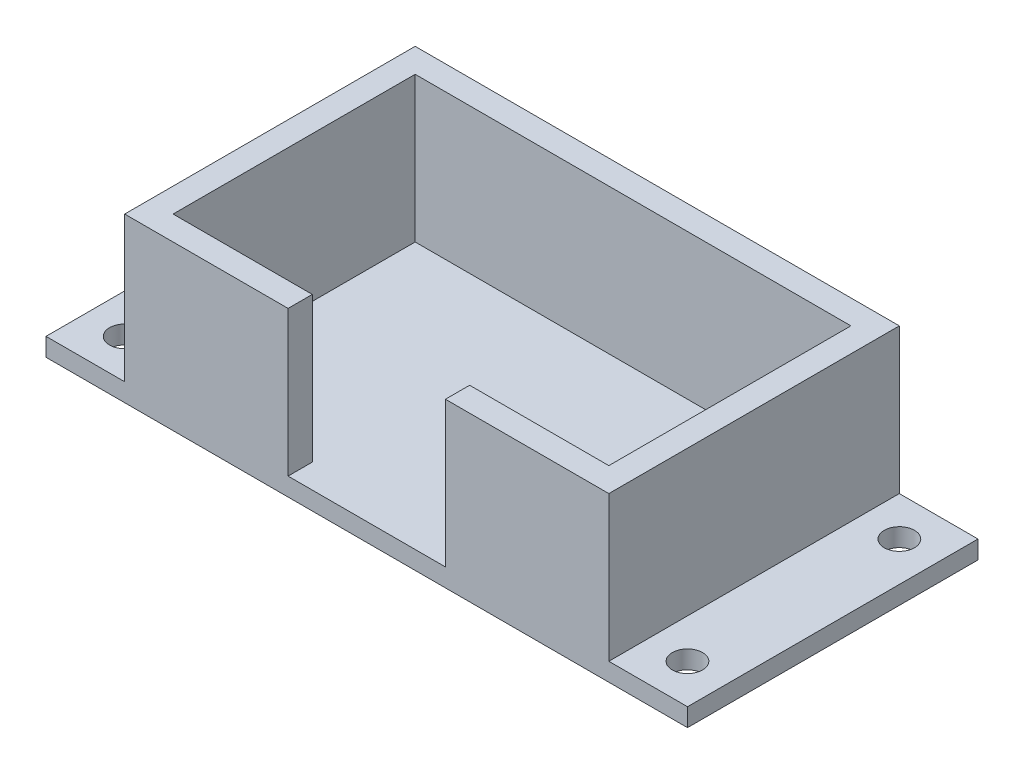
ISO-10303-21;
HEADER;
FILE_DESCRIPTION(('STEP AP214'),'2;1');
FILE_NAME('part.step','',(''),(''),'','','');
FILE_SCHEMA(('AUTOMOTIVE_DESIGN { 1 0 10303 214 1 1 1 1 }'));
ENDSEC;
DATA;
#1=APPLICATION_CONTEXT('core data for automotive mechanical design processes');
#2=APPLICATION_PROTOCOL_DEFINITION('international standard','automotive_design',2000,#1);
#3=PRODUCT_CONTEXT('',#1,'mechanical');
#4=PRODUCT('Part','Part','',(#3));
#5=PRODUCT_RELATED_PRODUCT_CATEGORY('part','',(#4));
#6=PRODUCT_DEFINITION_FORMATION('','',#4);
#7=PRODUCT_DEFINITION_CONTEXT('part definition',#1,'design');
#8=PRODUCT_DEFINITION('design','',#6,#7);
#9=PRODUCT_DEFINITION_SHAPE('','',#8);
#10=(LENGTH_UNIT() NAMED_UNIT(*) SI_UNIT(.MILLI.,.METRE.));
#11=(NAMED_UNIT(*) PLANE_ANGLE_UNIT() SI_UNIT($,.RADIAN.));
#12=(NAMED_UNIT(*) SI_UNIT($,.STERADIAN.) SOLID_ANGLE_UNIT());
#13=UNCERTAINTY_MEASURE_WITH_UNIT(LENGTH_MEASURE(1.E-05),#10,'distance_accuracy_value','');
#14=(GEOMETRIC_REPRESENTATION_CONTEXT(3) GLOBAL_UNCERTAINTY_ASSIGNED_CONTEXT((#13)) GLOBAL_UNIT_ASSIGNED_CONTEXT((#10,
#11,#12)) REPRESENTATION_CONTEXT('',''));
#15=CARTESIAN_POINT('',(0.,0.,0.));
#16=DIRECTION('',(0.,0.,1.));
#17=DIRECTION('',(1.,0.,0.));
#18=AXIS2_PLACEMENT_3D('',#15,#16,#17);
#19=CARTESIAN_POINT('',(0.,3.,0.));
#20=DIRECTION('',(0.,1.,0.));
#21=DIRECTION('',(0.,0.,1.));
#22=AXIS2_PLACEMENT_3D('',#19,#20,#21);
#23=PLANE('',#22);
#24=DIRECTION('',(0.,0.,1.));
#25=VECTOR('',#24,1.);
#26=CARTESIAN_POINT('',(-48.1932702603594,3.,11.4867913458012));
#27=LINE('',#26,#25);
#28=CARTESIAN_POINT('',(-48.1932702603594,3.,-36.5132086541988));
#29=VERTEX_POINT('',#28);
#30=CARTESIAN_POINT('',(-48.1932702603594,3.,11.4867913458012));
#31=VERTEX_POINT('',#30);
#32=EDGE_CURVE('E297',#29,#31,#27,.T.);
#33=ORIENTED_EDGE('',*,*,#32,.F.);
#34=DIRECTION('',(-1.,0.,0.));
#35=VECTOR('',#34,1.);
#36=CARTESIAN_POINT('',(44.8067297396406,3.,-36.5132086541988));
#37=LINE('',#36,#35);
#38=CARTESIAN_POINT('',(-61.1932702603594,3.,-36.5132086541988));
#39=VERTEX_POINT('',#38);
#40=EDGE_CURVE('E227',#29,#39,#37,.T.);
#41=ORIENTED_EDGE('',*,*,#40,.T.);
#42=DIRECTION('',(0.,0.,1.));
#43=VECTOR('',#42,1.);
#44=CARTESIAN_POINT('',(-61.1932702603594,3.,-36.5132086541988));
#45=LINE('',#44,#43);
#46=CARTESIAN_POINT('',(-61.1932702603594,3.,11.4867913458012));
#47=VERTEX_POINT('',#46);
#48=EDGE_CURVE('E226',#39,#47,#45,.T.);
#49=ORIENTED_EDGE('',*,*,#48,.T.);
#50=DIRECTION('',(1.,0.,0.));
#51=VECTOR('',#50,1.);
#52=CARTESIAN_POINT('',(-61.1932702603594,3.,11.4867913458012));
#53=LINE('',#52,#51);
#54=EDGE_CURVE('E231',#47,#31,#53,.T.);
#55=ORIENTED_EDGE('',*,*,#54,.T.);
#56=EDGE_LOOP('',(#33,#41,#49,#55));
#57=FACE_BOUND('',#56,.T.);
#58=CARTESIAN_POINT('',(-54.6901715011559,3.,4.98679134580125));
#59=DIRECTION('',(0.,1.,0.));
#60=DIRECTION('',(0.,0.,1.));
#61=AXIS2_PLACEMENT_3D('',#58,#59,#60);
#62=CIRCLE('',#61,2.5);
#63=CARTESIAN_POINT('',(-54.6901715011559,3.,7.48679134580125));
#64=VERTEX_POINT('',#63);
#65=EDGE_CURVE('E207',#64,#64,#62,.T.);
#66=ORIENTED_EDGE('',*,*,#65,.F.);
#67=EDGE_LOOP('',(#66));
#68=FACE_BOUND('',#67,.T.);
#69=CARTESIAN_POINT('',(-54.7235519989521,3.,-30.0132086541988));
#70=DIRECTION('',(0.,1.,0.));
#71=DIRECTION('',(0.,0.,1.));
#72=AXIS2_PLACEMENT_3D('',#69,#70,#71);
#73=CIRCLE('',#72,2.5);
#74=CARTESIAN_POINT('',(-54.7235519989521,3.,-27.5132086541988));
#75=VERTEX_POINT('',#74);
#76=EDGE_CURVE('E215',#75,#75,#73,.T.);
#77=ORIENTED_EDGE('',*,*,#76,.F.);
#78=EDGE_LOOP('',(#77));
#79=FACE_BOUND('',#78,.T.);
#80=ADVANCED_FACE('F45',(#57,#68,#79),#23,.T.);
#81=DIRECTION('',(0.,0.,-1.));
#82=VECTOR('',#81,1.);
#83=CARTESIAN_POINT('',(31.8067297396406,3.,-36.5132086541988));
#84=LINE('',#83,#82);
#85=CARTESIAN_POINT('',(31.8067297396406,3.,11.4867913458012));
#86=VERTEX_POINT('',#85);
#87=CARTESIAN_POINT('',(31.8067297396406,3.,-36.5132086541988));
#88=VERTEX_POINT('',#87);
#89=EDGE_CURVE('E288',#86,#88,#84,.T.);
#90=ORIENTED_EDGE('',*,*,#89,.F.);
#91=CARTESIAN_POINT('',(44.8067297396406,3.,11.4867913458012));
#92=VERTEX_POINT('',#91);
#93=EDGE_CURVE('E230',#86,#92,#53,.T.);
#94=ORIENTED_EDGE('',*,*,#93,.T.);
#95=DIRECTION('',(0.,0.,-1.));
#96=VECTOR('',#95,1.);
#97=CARTESIAN_POINT('',(44.8067297396406,3.,11.4867913458012));
#98=LINE('',#97,#96);
#99=CARTESIAN_POINT('',(44.8067297396406,3.,-36.5132086541988));
#100=VERTEX_POINT('',#99);
#101=EDGE_CURVE('E234',#92,#100,#98,.T.);
#102=ORIENTED_EDGE('',*,*,#101,.T.);
#103=EDGE_CURVE('E223',#100,#88,#37,.T.);
#104=ORIENTED_EDGE('',*,*,#103,.T.);
#105=EDGE_LOOP('',(#90,#94,#102,#104));
#106=FACE_BOUND('',#105,.T.);
#107=CARTESIAN_POINT('',(38.315604170315,3.,-30.0132086541988));
#108=DIRECTION('',(0.,1.,0.));
#109=DIRECTION('',(0.,0.,1.));
#110=AXIS2_PLACEMENT_3D('',#107,#108,#109);
#111=CIRCLE('',#110,2.5);
#112=CARTESIAN_POINT('',(38.315604170315,3.,-27.5132086541988));
#113=VERTEX_POINT('',#112);
#114=EDGE_CURVE('E199',#113,#113,#111,.T.);
#115=ORIENTED_EDGE('',*,*,#114,.F.);
#116=EDGE_LOOP('',(#115));
#117=FACE_BOUND('',#116,.T.);
#118=CARTESIAN_POINT('',(38.2979468074763,3.,4.98679134580125));
#119=DIRECTION('',(0.,1.,0.));
#120=DIRECTION('',(0.,0.,1.));
#121=AXIS2_PLACEMENT_3D('',#118,#119,#120);
#122=CIRCLE('',#121,2.5);
#123=CARTESIAN_POINT('',(38.2979468074763,3.,7.48679134580125));
#124=VERTEX_POINT('',#123);
#125=EDGE_CURVE('E189',#124,#124,#122,.T.);
#126=ORIENTED_EDGE('',*,*,#125,.F.);
#127=EDGE_LOOP('',(#126));
#128=FACE_BOUND('',#127,.T.);
#129=ADVANCED_FACE('F286',(#106,#117,#128),#23,.T.);
#130=DIRECTION('',(0.,0.,-1.));
#131=VECTOR('',#130,1.);
#132=CARTESIAN_POINT('',(-21.1932702603594,3.,11.4867913458012));
#133=LINE('',#132,#131);
#134=CARTESIAN_POINT('',(-21.1932702603594,3.,11.4867913458012));
#135=VERTEX_POINT('',#134);
#136=CARTESIAN_POINT('',(-21.1932702603594,3.,7.48679134580125));
#137=VERTEX_POINT('',#136);
#138=EDGE_CURVE('E180',#135,#137,#133,.T.);
#139=ORIENTED_EDGE('',*,*,#138,.F.);
#140=CARTESIAN_POINT('',(4.80672973964064,3.,11.4867913458012));
#141=VERTEX_POINT('',#140);
#142=EDGE_CURVE('E235',#135,#141,#53,.T.);
#143=ORIENTED_EDGE('',*,*,#142,.T.);
#144=DIRECTION('',(0.,0.,1.));
#145=VECTOR('',#144,1.);
#146=CARTESIAN_POINT('',(4.80672973964063,3.,7.48679134580125));
#147=LINE('',#146,#145);
#148=CARTESIAN_POINT('',(4.80672973964063,3.,7.48679134580125));
#149=VERTEX_POINT('',#148);
#150=EDGE_CURVE('E68',#149,#141,#147,.T.);
#151=ORIENTED_EDGE('',*,*,#150,.F.);
#152=DIRECTION('',(-1.,0.,0.));
#153=VECTOR('',#152,1.);
#154=CARTESIAN_POINT('',(27.8067297396406,3.,7.48679134580125));
#155=LINE('',#154,#153);
#156=CARTESIAN_POINT('',(27.8067297396406,3.,7.48679134580125));
#157=VERTEX_POINT('',#156);
#158=EDGE_CURVE('E303',#157,#149,#155,.T.);
#159=ORIENTED_EDGE('',*,*,#158,.F.);
#160=DIRECTION('',(0.,0.,1.));
#161=VECTOR('',#160,1.);
#162=CARTESIAN_POINT('',(27.8067297396406,3.,-32.5132086541987));
#163=LINE('',#162,#161);
#164=CARTESIAN_POINT('',(27.8067297396406,3.,-32.5132086541987));
#165=VERTEX_POINT('',#164);
#166=EDGE_CURVE('E346',#165,#157,#163,.T.);
#167=ORIENTED_EDGE('',*,*,#166,.F.);
#168=DIRECTION('',(1.,0.,0.));
#169=VECTOR('',#168,1.);
#170=CARTESIAN_POINT('',(-44.1932702603594,3.,-32.5132086541987));
#171=LINE('',#170,#169);
#172=CARTESIAN_POINT('',(-44.1932702603594,3.,-32.5132086541987));
#173=VERTEX_POINT('',#172);
#174=EDGE_CURVE('E351',#173,#165,#171,.T.);
#175=ORIENTED_EDGE('',*,*,#174,.F.);
#176=DIRECTION('',(0.,0.,-1.));
#177=VECTOR('',#176,1.);
#178=CARTESIAN_POINT('',(-44.1932702603594,3.,-32.5132086541987));
#179=LINE('',#178,#177);
#180=CARTESIAN_POINT('',(-44.1932702603594,3.,7.48679134580125));
#181=VERTEX_POINT('',#180);
#182=EDGE_CURVE('E353',#181,#173,#179,.T.);
#183=ORIENTED_EDGE('',*,*,#182,.F.);
#184=DIRECTION('',(-1.,0.,0.));
#185=VECTOR('',#184,1.);
#186=CARTESIAN_POINT('',(-44.1932702603594,3.,7.48679134580125));
#187=LINE('',#186,#185);
#188=EDGE_CURVE('E61',#137,#181,#187,.T.);
#189=ORIENTED_EDGE('',*,*,#188,.F.);
#190=EDGE_LOOP('',(#139,#143,#151,#159,#167,#175,#183,#189));
#191=FACE_BOUND('',#190,.T.);
#192=ADVANCED_FACE('F402',(#191),#23,.T.);
#193=CARTESIAN_POINT('',(0.,0.,0.));
#194=DIRECTION('',(0.,1.,0.));
#195=DIRECTION('',(0.,0.,1.));
#196=AXIS2_PLACEMENT_3D('',#193,#194,#195);
#197=PLANE('',#196);
#198=DIRECTION('',(-1.,0.,0.));
#199=VECTOR('',#198,1.);
#200=CARTESIAN_POINT('',(44.8067297396406,0.,-36.5132086541988));
#201=LINE('',#200,#199);
#202=CARTESIAN_POINT('',(44.8067297396406,0.,-36.5132086541988));
#203=VERTEX_POINT('',#202);
#204=CARTESIAN_POINT('',(-61.1932702603594,0.,-36.5132086541988));
#205=VERTEX_POINT('',#204);
#206=EDGE_CURVE('E219',#203,#205,#201,.T.);
#207=ORIENTED_EDGE('',*,*,#206,.F.);
#208=DIRECTION('',(0.,0.,-1.));
#209=VECTOR('',#208,1.);
#210=CARTESIAN_POINT('',(44.8067297396406,0.,11.4867913458012));
#211=LINE('',#210,#209);
#212=CARTESIAN_POINT('',(44.8067297396406,0.,11.4867913458012));
#213=VERTEX_POINT('',#212);
#214=EDGE_CURVE('E248',#213,#203,#211,.T.);
#215=ORIENTED_EDGE('',*,*,#214,.F.);
#216=DIRECTION('',(1.,0.,0.));
#217=VECTOR('',#216,1.);
#218=CARTESIAN_POINT('',(-61.1932702603594,0.,11.4867913458012));
#219=LINE('',#218,#217);
#220=CARTESIAN_POINT('',(-61.1932702603594,0.,11.4867913458012));
#221=VERTEX_POINT('',#220);
#222=EDGE_CURVE('E245',#221,#213,#219,.T.);
#223=ORIENTED_EDGE('',*,*,#222,.F.);
#224=DIRECTION('',(0.,0.,1.));
#225=VECTOR('',#224,1.);
#226=CARTESIAN_POINT('',(-61.1932702603594,0.,-36.5132086541988));
#227=LINE('',#226,#225);
#228=EDGE_CURVE('E242',#205,#221,#227,.T.);
#229=ORIENTED_EDGE('',*,*,#228,.F.);
#230=EDGE_LOOP('',(#207,#215,#223,#229));
#231=FACE_BOUND('',#230,.T.);
#232=CARTESIAN_POINT('',(-54.7235519989521,0.,-30.0132086541988));
#233=DIRECTION('',(0.,1.,0.));
#234=DIRECTION('',(0.,0.,1.));
#235=AXIS2_PLACEMENT_3D('',#232,#233,#234);
#236=CIRCLE('',#235,2.5);
#237=CARTESIAN_POINT('',(-54.7235519989521,0.,-27.5132086541988));
#238=VERTEX_POINT('',#237);
#239=EDGE_CURVE('E211',#238,#238,#236,.T.);
#240=ORIENTED_EDGE('',*,*,#239,.T.);
#241=EDGE_LOOP('',(#240));
#242=FACE_BOUND('',#241,.T.);
#243=CARTESIAN_POINT('',(-54.6901715011559,0.,4.98679134580125));
#244=DIRECTION('',(0.,1.,0.));
#245=DIRECTION('',(0.,0.,1.));
#246=AXIS2_PLACEMENT_3D('',#243,#244,#245);
#247=CIRCLE('',#246,2.5);
#248=CARTESIAN_POINT('',(-54.6901715011559,0.,7.48679134580125));
#249=VERTEX_POINT('',#248);
#250=EDGE_CURVE('E203',#249,#249,#247,.T.);
#251=ORIENTED_EDGE('',*,*,#250,.T.);
#252=EDGE_LOOP('',(#251));
#253=FACE_BOUND('',#252,.T.);
#254=CARTESIAN_POINT('',(38.315604170315,0.,-30.0132086541988));
#255=DIRECTION('',(0.,1.,0.));
#256=DIRECTION('',(0.,0.,1.));
#257=AXIS2_PLACEMENT_3D('',#254,#255,#256);
#258=CIRCLE('',#257,2.5);
#259=CARTESIAN_POINT('',(38.315604170315,0.,-27.5132086541988));
#260=VERTEX_POINT('',#259);
#261=EDGE_CURVE('E197',#260,#260,#258,.T.);
#262=ORIENTED_EDGE('',*,*,#261,.T.);
#263=EDGE_LOOP('',(#262));
#264=FACE_BOUND('',#263,.T.);
#265=CARTESIAN_POINT('',(38.2979468074763,0.,4.98679134580125));
#266=DIRECTION('',(0.,1.,0.));
#267=DIRECTION('',(0.,0.,1.));
#268=AXIS2_PLACEMENT_3D('',#265,#266,#267);
#269=CIRCLE('',#268,2.5);
#270=CARTESIAN_POINT('',(38.2979468074763,0.,7.48679134580125));
#271=VERTEX_POINT('',#270);
#272=EDGE_CURVE('E184',#271,#271,#269,.T.);
#273=ORIENTED_EDGE('',*,*,#272,.T.);
#274=EDGE_LOOP('',(#273));
#275=FACE_BOUND('',#274,.T.);
#276=ADVANCED_FACE('F271',(#231,#242,#253,#264,#275),#197,.F.);
#277=CARTESIAN_POINT('',(44.8067297396406,3.,-36.5132086541988));
#278=DIRECTION('',(0.,0.,1.));
#279=DIRECTION('',(1.,0.,0.));
#280=AXIS2_PLACEMENT_3D('',#277,#278,#279);
#281=PLANE('',#280);
#282=ORIENTED_EDGE('',*,*,#206,.T.);
#283=DIRECTION('',(0.,-1.,0.));
#284=VECTOR('',#283,1.);
#285=CARTESIAN_POINT('',(-61.1932702603594,3.,-36.5132086541988));
#286=LINE('',#285,#284);
#287=EDGE_CURVE('E11',#39,#205,#286,.T.);
#288=ORIENTED_EDGE('',*,*,#287,.F.);
#289=ORIENTED_EDGE('',*,*,#40,.F.);
#290=DIRECTION('',(0.,-1.,0.));
#291=VECTOR('',#290,1.);
#292=CARTESIAN_POINT('',(-48.1932702603594,27.,-36.5132086541988));
#293=LINE('',#292,#291);
#294=CARTESIAN_POINT('',(-48.1932702603594,27.,-36.5132086541988));
#295=VERTEX_POINT('',#294);
#296=EDGE_CURVE('E319',#295,#29,#293,.T.);
#297=ORIENTED_EDGE('',*,*,#296,.F.);
#298=DIRECTION('',(-1.,0.,0.));
#299=VECTOR('',#298,1.);
#300=CARTESIAN_POINT('',(-48.1932702603594,27.,-36.5132086541988));
#301=LINE('',#300,#299);
#302=CARTESIAN_POINT('',(31.8067297396406,27.,-36.5132086541988));
#303=VERTEX_POINT('',#302);
#304=EDGE_CURVE('E384',#303,#295,#301,.T.);
#305=ORIENTED_EDGE('',*,*,#304,.F.);
#306=DIRECTION('',(0.,-1.,0.));
#307=VECTOR('',#306,1.);
#308=CARTESIAN_POINT('',(31.8067297396406,27.,-36.5132086541988));
#309=LINE('',#308,#307);
#310=EDGE_CURVE('E283',#303,#88,#309,.T.);
#311=ORIENTED_EDGE('',*,*,#310,.T.);
#312=ORIENTED_EDGE('',*,*,#103,.F.);
#313=DIRECTION('',(0.,-1.,0.));
#314=VECTOR('',#313,1.);
#315=CARTESIAN_POINT('',(44.8067297396406,3.,-36.5132086541988));
#316=LINE('',#315,#314);
#317=EDGE_CURVE('E238',#100,#203,#316,.T.);
#318=ORIENTED_EDGE('',*,*,#317,.T.);
#319=EDGE_LOOP('',(#282,#288,#289,#297,#305,#311,#312,#318));
#320=FACE_BOUND('',#319,.T.);
#321=ADVANCED_FACE('F47',(#320),#281,.F.);
#322=CARTESIAN_POINT('',(-61.1932702603594,3.,-36.5132086541988));
#323=DIRECTION('',(1.,0.,0.));
#324=DIRECTION('',(0.,0.,-1.));
#325=AXIS2_PLACEMENT_3D('',#322,#323,#324);
#326=PLANE('',#325);
#327=ORIENTED_EDGE('',*,*,#228,.T.);
#328=DIRECTION('',(0.,-1.,0.));
#329=VECTOR('',#328,1.);
#330=CARTESIAN_POINT('',(-61.1932702603594,3.,11.4867913458012));
#331=LINE('',#330,#329);
#332=EDGE_CURVE('E54',#47,#221,#331,.T.);
#333=ORIENTED_EDGE('',*,*,#332,.F.);
#334=ORIENTED_EDGE('',*,*,#48,.F.);
#335=ORIENTED_EDGE('',*,*,#287,.T.);
#336=EDGE_LOOP('',(#327,#333,#334,#335));
#337=FACE_BOUND('',#336,.T.);
#338=ADVANCED_FACE('F411',(#337),#326,.F.);
#339=CARTESIAN_POINT('',(-61.1932702603594,3.,11.4867913458012));
#340=DIRECTION('',(0.,0.,-1.));
#341=DIRECTION('',(-1.,0.,0.));
#342=AXIS2_PLACEMENT_3D('',#339,#340,#341);
#343=PLANE('',#342);
#344=ORIENTED_EDGE('',*,*,#222,.T.);
#345=DIRECTION('',(0.,-1.,0.));
#346=VECTOR('',#345,1.);
#347=CARTESIAN_POINT('',(44.8067297396406,3.,11.4867913458012));
#348=LINE('',#347,#346);
#349=EDGE_CURVE('E254',#92,#213,#348,.T.);
#350=ORIENTED_EDGE('',*,*,#349,.F.);
#351=ORIENTED_EDGE('',*,*,#93,.F.);
#352=DIRECTION('',(0.,-1.,0.));
#353=VECTOR('',#352,1.);
#354=CARTESIAN_POINT('',(31.8067297396406,27.,11.4867913458012));
#355=LINE('',#354,#353);
#356=CARTESIAN_POINT('',(31.8067297396406,27.,11.4867913458012));
#357=VERTEX_POINT('',#356);
#358=EDGE_CURVE('E295',#357,#86,#355,.T.);
#359=ORIENTED_EDGE('',*,*,#358,.F.);
#360=DIRECTION('',(1.,0.,0.));
#361=VECTOR('',#360,1.);
#362=CARTESIAN_POINT('',(4.80672973964063,27.,11.4867913458012));
#363=LINE('',#362,#361);
#364=CARTESIAN_POINT('',(4.80672973964063,27.,11.4867913458012));
#365=VERTEX_POINT('',#364);
#366=EDGE_CURVE('E372',#365,#357,#363,.T.);
#367=ORIENTED_EDGE('',*,*,#366,.F.);
#368=DIRECTION('',(0.,-1.,0.));
#369=VECTOR('',#368,1.);
#370=CARTESIAN_POINT('',(4.80672973964063,27.,11.4867913458012));
#371=LINE('',#370,#369);
#372=EDGE_CURVE('E327',#365,#141,#371,.T.);
#373=ORIENTED_EDGE('',*,*,#372,.T.);
#374=ORIENTED_EDGE('',*,*,#142,.F.);
#375=DIRECTION('',(0.,-1.,0.));
#376=VECTOR('',#375,1.);
#377=CARTESIAN_POINT('',(-21.1932702603594,27.,11.4867913458012));
#378=LINE('',#377,#376);
#379=CARTESIAN_POINT('',(-21.1932702603594,27.,11.4867913458012));
#380=VERTEX_POINT('',#379);
#381=EDGE_CURVE('E312',#380,#135,#378,.T.);
#382=ORIENTED_EDGE('',*,*,#381,.F.);
#383=DIRECTION('',(1.,0.,0.));
#384=VECTOR('',#383,1.);
#385=CARTESIAN_POINT('',(-48.1932702603594,27.,11.4867913458012));
#386=LINE('',#385,#384);
#387=CARTESIAN_POINT('',(-48.1932702603594,27.,11.4867913458012));
#388=VERTEX_POINT('',#387);
#389=EDGE_CURVE('E390',#388,#380,#386,.T.);
#390=ORIENTED_EDGE('',*,*,#389,.F.);
#391=DIRECTION('',(0.,-1.,0.));
#392=VECTOR('',#391,1.);
#393=CARTESIAN_POINT('',(-48.1932702603594,27.,11.4867913458012));
#394=LINE('',#393,#392);
#395=EDGE_CURVE('E316',#388,#31,#394,.T.);
#396=ORIENTED_EDGE('',*,*,#395,.T.);
#397=ORIENTED_EDGE('',*,*,#54,.F.);
#398=ORIENTED_EDGE('',*,*,#332,.T.);
#399=EDGE_LOOP('',(#344,#350,#351,#359,#367,#373,#374,#382,#390,#396,#397,#398));
#400=FACE_BOUND('',#399,.T.);
#401=ADVANCED_FACE('F263',(#400),#343,.F.);
#402=CARTESIAN_POINT('',(44.8067297396406,3.,11.4867913458012));
#403=DIRECTION('',(-1.,0.,0.));
#404=DIRECTION('',(0.,0.,1.));
#405=AXIS2_PLACEMENT_3D('',#402,#403,#404);
#406=PLANE('',#405);
#407=ORIENTED_EDGE('',*,*,#214,.T.);
#408=ORIENTED_EDGE('',*,*,#317,.F.);
#409=ORIENTED_EDGE('',*,*,#101,.F.);
#410=ORIENTED_EDGE('',*,*,#349,.T.);
#411=EDGE_LOOP('',(#407,#408,#409,#410));
#412=FACE_BOUND('',#411,.T.);
#413=ADVANCED_FACE('F275',(#412),#406,.F.);
#414=CARTESIAN_POINT('',(-54.7235519989521,3.,-30.0132086541988));
#415=DIRECTION('',(0.,-1.,0.));
#416=DIRECTION('',(0.,0.,-1.));
#417=AXIS2_PLACEMENT_3D('',#414,#415,#416);
#418=CYLINDRICAL_SURFACE('',#417,2.5);
#419=ORIENTED_EDGE('',*,*,#76,.T.);
#420=EDGE_LOOP('',(#419));
#421=FACE_BOUND('',#420,.T.);
#422=ORIENTED_EDGE('',*,*,#239,.F.);
#423=EDGE_LOOP('',(#422));
#424=FACE_BOUND('',#423,.T.);
#425=ADVANCED_FACE('F434',(#421,#424),#418,.F.);
#426=CARTESIAN_POINT('',(-54.6901715011559,3.,4.98679134580125));
#427=DIRECTION('',(0.,-1.,0.));
#428=DIRECTION('',(0.,0.,-1.));
#429=AXIS2_PLACEMENT_3D('',#426,#427,#428);
#430=CYLINDRICAL_SURFACE('',#429,2.5);
#431=ORIENTED_EDGE('',*,*,#65,.T.);
#432=EDGE_LOOP('',(#431));
#433=FACE_BOUND('',#432,.T.);
#434=ORIENTED_EDGE('',*,*,#250,.F.);
#435=EDGE_LOOP('',(#434));
#436=FACE_BOUND('',#435,.T.);
#437=ADVANCED_FACE('F438',(#433,#436),#430,.F.);
#438=CARTESIAN_POINT('',(38.315604170315,3.,-30.0132086541988));
#439=DIRECTION('',(0.,-1.,0.));
#440=DIRECTION('',(0.,0.,-1.));
#441=AXIS2_PLACEMENT_3D('',#438,#439,#440);
#442=CYLINDRICAL_SURFACE('',#441,2.5);
#443=ORIENTED_EDGE('',*,*,#114,.T.);
#444=EDGE_LOOP('',(#443));
#445=FACE_BOUND('',#444,.T.);
#446=ORIENTED_EDGE('',*,*,#261,.F.);
#447=EDGE_LOOP('',(#446));
#448=FACE_BOUND('',#447,.T.);
#449=ADVANCED_FACE('F443',(#445,#448),#442,.F.);
#450=CARTESIAN_POINT('',(38.2979468074763,3.,4.98679134580125));
#451=DIRECTION('',(0.,-1.,0.));
#452=DIRECTION('',(0.,0.,-1.));
#453=AXIS2_PLACEMENT_3D('',#450,#451,#452);
#454=CYLINDRICAL_SURFACE('',#453,2.5);
#455=ORIENTED_EDGE('',*,*,#125,.T.);
#456=EDGE_LOOP('',(#455));
#457=FACE_BOUND('',#456,.T.);
#458=ORIENTED_EDGE('',*,*,#272,.F.);
#459=EDGE_LOOP('',(#458));
#460=FACE_BOUND('',#459,.T.);
#461=ADVANCED_FACE('F450',(#457,#460),#454,.F.);
#462=CARTESIAN_POINT('',(-44.1932702603594,27.,7.48679134580125));
#463=DIRECTION('',(0.,0.,1.));
#464=DIRECTION('',(1.,0.,0.));
#465=AXIS2_PLACEMENT_3D('',#462,#463,#464);
#466=PLANE('',#465);
#467=ORIENTED_EDGE('',*,*,#188,.T.);
#468=DIRECTION('',(0.,-1.,0.));
#469=VECTOR('',#468,1.);
#470=CARTESIAN_POINT('',(-44.1932702603594,27.,7.48679134580125));
#471=LINE('',#470,#469);
#472=CARTESIAN_POINT('',(-44.1932702603594,27.,7.48679134580125));
#473=VERTEX_POINT('',#472);
#474=EDGE_CURVE('E163',#473,#181,#471,.T.);
#475=ORIENTED_EDGE('',*,*,#474,.F.);
#476=DIRECTION('',(-1.,0.,0.));
#477=VECTOR('',#476,1.);
#478=CARTESIAN_POINT('',(-44.1932702603594,27.,7.48679134580125));
#479=LINE('',#478,#477);
#480=CARTESIAN_POINT('',(-21.1932702603594,27.,7.48679134580125));
#481=VERTEX_POINT('',#480);
#482=EDGE_CURVE('E170',#481,#473,#479,.T.);
#483=ORIENTED_EDGE('',*,*,#482,.F.);
#484=DIRECTION('',(0.,-1.,0.));
#485=VECTOR('',#484,1.);
#486=CARTESIAN_POINT('',(-21.1932702603594,27.,7.48679134580125));
#487=LINE('',#486,#485);
#488=EDGE_CURVE('E309',#481,#137,#487,.T.);
#489=ORIENTED_EDGE('',*,*,#488,.T.);
#490=EDGE_LOOP('',(#467,#475,#483,#489));
#491=FACE_BOUND('',#490,.T.);
#492=ADVANCED_FACE('F182',(#491),#466,.F.);
#493=CARTESIAN_POINT('',(-44.1932702603594,27.,-32.5132086541987));
#494=DIRECTION('',(-1.,0.,0.));
#495=DIRECTION('',(0.,0.,1.));
#496=AXIS2_PLACEMENT_3D('',#493,#494,#495);
#497=PLANE('',#496);
#498=ORIENTED_EDGE('',*,*,#182,.T.);
#499=DIRECTION('',(0.,-1.,0.));
#500=VECTOR('',#499,1.);
#501=CARTESIAN_POINT('',(-44.1932702603594,27.,-32.5132086541987));
#502=LINE('',#501,#500);
#503=CARTESIAN_POINT('',(-44.1932702603594,27.,-32.5132086541987));
#504=VERTEX_POINT('',#503);
#505=EDGE_CURVE('E165',#504,#173,#502,.T.);
#506=ORIENTED_EDGE('',*,*,#505,.F.);
#507=DIRECTION('',(0.,0.,-1.));
#508=VECTOR('',#507,1.);
#509=CARTESIAN_POINT('',(-44.1932702603594,27.,-32.5132086541987));
#510=LINE('',#509,#508);
#511=EDGE_CURVE('E158',#473,#504,#510,.T.);
#512=ORIENTED_EDGE('',*,*,#511,.F.);
#513=ORIENTED_EDGE('',*,*,#474,.T.);
#514=EDGE_LOOP('',(#498,#506,#512,#513));
#515=FACE_BOUND('',#514,.T.);
#516=ADVANCED_FACE('F161',(#515),#497,.F.);
#517=CARTESIAN_POINT('',(-44.1932702603594,27.,-32.5132086541987));
#518=DIRECTION('',(0.,0.,-1.));
#519=DIRECTION('',(-1.,0.,0.));
#520=AXIS2_PLACEMENT_3D('',#517,#518,#519);
#521=PLANE('',#520);
#522=ORIENTED_EDGE('',*,*,#174,.T.);
#523=DIRECTION('',(0.,-1.,0.));
#524=VECTOR('',#523,1.);
#525=CARTESIAN_POINT('',(27.8067297396406,27.,-32.5132086541987));
#526=LINE('',#525,#524);
#527=CARTESIAN_POINT('',(27.8067297396406,27.,-32.5132086541987));
#528=VERTEX_POINT('',#527);
#529=EDGE_CURVE('E191',#528,#165,#526,.T.);
#530=ORIENTED_EDGE('',*,*,#529,.F.);
#531=DIRECTION('',(1.,0.,0.));
#532=VECTOR('',#531,1.);
#533=CARTESIAN_POINT('',(-44.1932702603594,27.,-32.5132086541987));
#534=LINE('',#533,#532);
#535=EDGE_CURVE('E169',#504,#528,#534,.T.);
#536=ORIENTED_EDGE('',*,*,#535,.F.);
#537=ORIENTED_EDGE('',*,*,#505,.T.);
#538=EDGE_LOOP('',(#522,#530,#536,#537));
#539=FACE_BOUND('',#538,.T.);
#540=ADVANCED_FACE('F350',(#539),#521,.F.);
#541=CARTESIAN_POINT('',(27.8067297396406,27.,-32.5132086541987));
#542=DIRECTION('',(1.,0.,0.));
#543=DIRECTION('',(0.,0.,-1.));
#544=AXIS2_PLACEMENT_3D('',#541,#542,#543);
#545=PLANE('',#544);
#546=ORIENTED_EDGE('',*,*,#166,.T.);
#547=DIRECTION('',(0.,-1.,0.));
#548=VECTOR('',#547,1.);
#549=CARTESIAN_POINT('',(27.8067297396406,27.,7.48679134580125));
#550=LINE('',#549,#548);
#551=CARTESIAN_POINT('',(27.8067297396406,27.,7.48679134580125));
#552=VERTEX_POINT('',#551);
#553=EDGE_CURVE('E335',#552,#157,#550,.T.);
#554=ORIENTED_EDGE('',*,*,#553,.F.);
#555=DIRECTION('',(0.,0.,1.));
#556=VECTOR('',#555,1.);
#557=CARTESIAN_POINT('',(27.8067297396406,27.,-32.5132086541987));
#558=LINE('',#557,#556);
#559=EDGE_CURVE('E347',#528,#552,#558,.T.);
#560=ORIENTED_EDGE('',*,*,#559,.F.);
#561=ORIENTED_EDGE('',*,*,#529,.T.);
#562=EDGE_LOOP('',(#546,#554,#560,#561));
#563=FACE_BOUND('',#562,.T.);
#564=ADVANCED_FACE('F344',(#563),#545,.F.);
#565=CARTESIAN_POINT('',(27.8067297396406,27.,7.48679134580125));
#566=DIRECTION('',(0.,0.,1.));
#567=DIRECTION('',(1.,0.,0.));
#568=AXIS2_PLACEMENT_3D('',#565,#566,#567);
#569=PLANE('',#568);
#570=ORIENTED_EDGE('',*,*,#158,.T.);
#571=DIRECTION('',(0.,-1.,0.));
#572=VECTOR('',#571,1.);
#573=CARTESIAN_POINT('',(4.80672973964063,27.,7.48679134580125));
#574=LINE('',#573,#572);
#575=CARTESIAN_POINT('',(4.80672973964063,27.,7.48679134580125));
#576=VERTEX_POINT('',#575);
#577=EDGE_CURVE('E331',#576,#149,#574,.T.);
#578=ORIENTED_EDGE('',*,*,#577,.F.);
#579=DIRECTION('',(-1.,0.,0.));
#580=VECTOR('',#579,1.);
#581=CARTESIAN_POINT('',(27.8067297396406,27.,7.48679134580125));
#582=LINE('',#581,#580);
#583=EDGE_CURVE('E373',#552,#576,#582,.T.);
#584=ORIENTED_EDGE('',*,*,#583,.F.);
#585=ORIENTED_EDGE('',*,*,#553,.T.);
#586=EDGE_LOOP('',(#570,#578,#584,#585));
#587=FACE_BOUND('',#586,.T.);
#588=ADVANCED_FACE('F363',(#587),#569,.F.);
#589=CARTESIAN_POINT('',(4.80672973964063,27.,7.48679134580125));
#590=DIRECTION('',(1.,0.,0.));
#591=DIRECTION('',(0.,0.,-1.));
#592=AXIS2_PLACEMENT_3D('',#589,#590,#591);
#593=PLANE('',#592);
#594=ORIENTED_EDGE('',*,*,#150,.T.);
#595=ORIENTED_EDGE('',*,*,#372,.F.);
#596=DIRECTION('',(0.,0.,1.));
#597=VECTOR('',#596,1.);
#598=CARTESIAN_POINT('',(4.80672973964063,27.,7.48679134580125));
#599=LINE('',#598,#597);
#600=EDGE_CURVE('E369',#576,#365,#599,.T.);
#601=ORIENTED_EDGE('',*,*,#600,.F.);
#602=ORIENTED_EDGE('',*,*,#577,.T.);
#603=EDGE_LOOP('',(#594,#595,#601,#602));
#604=FACE_BOUND('',#603,.T.);
#605=ADVANCED_FACE('F367',(#604),#593,.F.);
#606=CARTESIAN_POINT('',(31.8067297396406,27.,-36.5132086541988));
#607=DIRECTION('',(-1.,0.,0.));
#608=DIRECTION('',(0.,0.,1.));
#609=AXIS2_PLACEMENT_3D('',#606,#607,#608);
#610=PLANE('',#609);
#611=ORIENTED_EDGE('',*,*,#89,.T.);
#612=ORIENTED_EDGE('',*,*,#310,.F.);
#613=DIRECTION('',(0.,0.,-1.));
#614=VECTOR('',#613,1.);
#615=CARTESIAN_POINT('',(31.8067297396406,27.,-36.5132086541988));
#616=LINE('',#615,#614);
#617=EDGE_CURVE('E377',#357,#303,#616,.T.);
#618=ORIENTED_EDGE('',*,*,#617,.F.);
#619=ORIENTED_EDGE('',*,*,#358,.T.);
#620=EDGE_LOOP('',(#611,#612,#618,#619));
#621=FACE_BOUND('',#620,.T.);
#622=ADVANCED_FACE('F292',(#621),#610,.F.);
#623=CARTESIAN_POINT('',(-48.1932702603594,27.,11.4867913458012));
#624=DIRECTION('',(1.,0.,0.));
#625=DIRECTION('',(0.,0.,-1.));
#626=AXIS2_PLACEMENT_3D('',#623,#624,#625);
#627=PLANE('',#626);
#628=ORIENTED_EDGE('',*,*,#32,.T.);
#629=ORIENTED_EDGE('',*,*,#395,.F.);
#630=DIRECTION('',(0.,0.,1.));
#631=VECTOR('',#630,1.);
#632=CARTESIAN_POINT('',(-48.1932702603594,27.,11.4867913458012));
#633=LINE('',#632,#631);
#634=EDGE_CURVE('E387',#295,#388,#633,.T.);
#635=ORIENTED_EDGE('',*,*,#634,.F.);
#636=ORIENTED_EDGE('',*,*,#296,.T.);
#637=EDGE_LOOP('',(#628,#629,#635,#636));
#638=FACE_BOUND('',#637,.T.);
#639=ADVANCED_FACE('F408',(#638),#627,.F.);
#640=CARTESIAN_POINT('',(-21.1932702603594,27.,11.4867913458012));
#641=DIRECTION('',(-1.,0.,0.));
#642=DIRECTION('',(0.,0.,1.));
#643=AXIS2_PLACEMENT_3D('',#640,#641,#642);
#644=PLANE('',#643);
#645=ORIENTED_EDGE('',*,*,#138,.T.);
#646=ORIENTED_EDGE('',*,*,#488,.F.);
#647=DIRECTION('',(0.,0.,-1.));
#648=VECTOR('',#647,1.);
#649=CARTESIAN_POINT('',(-21.1932702603594,27.,11.4867913458012));
#650=LINE('',#649,#648);
#651=EDGE_CURVE('E175',#380,#481,#650,.T.);
#652=ORIENTED_EDGE('',*,*,#651,.F.);
#653=ORIENTED_EDGE('',*,*,#381,.T.);
#654=EDGE_LOOP('',(#645,#646,#652,#653));
#655=FACE_BOUND('',#654,.T.);
#656=ADVANCED_FACE('F401',(#655),#644,.F.);
#657=CARTESIAN_POINT('',(0.,27.,0.));
#658=DIRECTION('',(0.,1.,0.));
#659=DIRECTION('',(0.,0.,1.));
#660=AXIS2_PLACEMENT_3D('',#657,#658,#659);
#661=PLANE('',#660);
#662=ORIENTED_EDGE('',*,*,#482,.T.);
#663=ORIENTED_EDGE('',*,*,#511,.T.);
#664=ORIENTED_EDGE('',*,*,#535,.T.);
#665=ORIENTED_EDGE('',*,*,#559,.T.);
#666=ORIENTED_EDGE('',*,*,#583,.T.);
#667=ORIENTED_EDGE('',*,*,#600,.T.);
#668=ORIENTED_EDGE('',*,*,#366,.T.);
#669=ORIENTED_EDGE('',*,*,#617,.T.);
#670=ORIENTED_EDGE('',*,*,#304,.T.);
#671=ORIENTED_EDGE('',*,*,#634,.T.);
#672=ORIENTED_EDGE('',*,*,#389,.T.);
#673=ORIENTED_EDGE('',*,*,#651,.T.);
#674=EDGE_LOOP('',(#662,#663,#664,#665,#666,#667,#668,#669,#670,#671,#672,#673));
#675=FACE_BOUND('',#674,.T.);
#676=ADVANCED_FACE('F173',(#675),#661,.T.);
#677=CLOSED_SHELL('',(#80,#129,#192,#276,#321,#338,#401,#413,#425,#437,#449,#461,#492,#516,#540,
#564,#588,#605,#622,#639,#656,#676));
#678=MANIFOLD_SOLID_BREP('B2',#677);
#679=ADVANCED_BREP_SHAPE_REPRESENTATION('',(#18,#678),#14);
#680=SHAPE_DEFINITION_REPRESENTATION(#9,#679);
ENDSEC;
END-ISO-10303-21;
